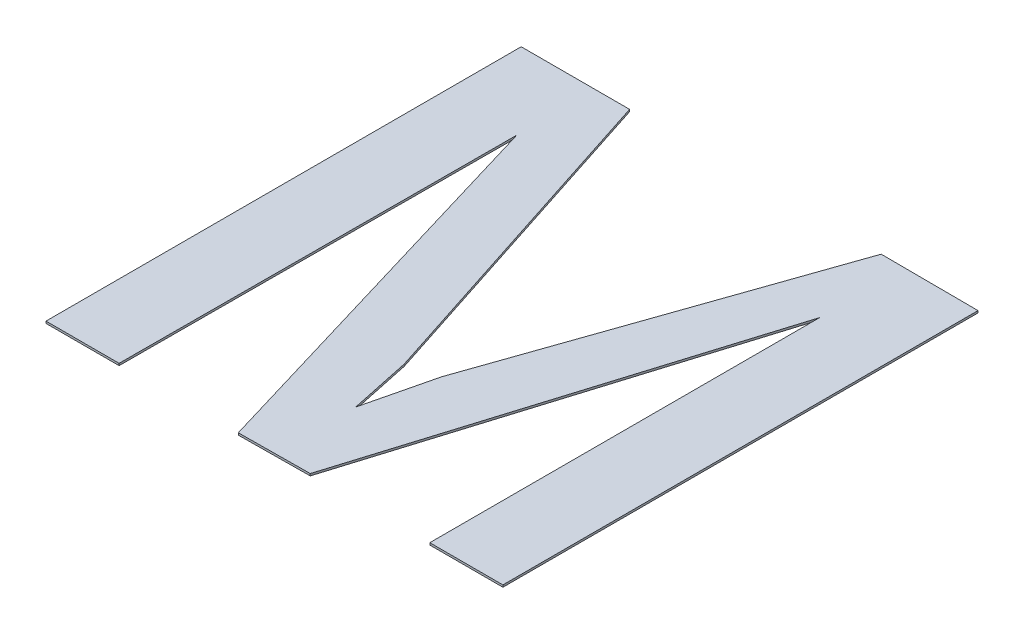
ISO-10303-21;
HEADER;
FILE_DESCRIPTION(('STEP AP214'),'2;1');
FILE_NAME('part.step','',(''),(''),'','','');
FILE_SCHEMA(('AUTOMOTIVE_DESIGN { 1 0 10303 214 1 1 1 1 }'));
ENDSEC;
DATA;
#1=APPLICATION_CONTEXT('core data for automotive mechanical design processes');
#2=APPLICATION_PROTOCOL_DEFINITION('international standard','automotive_design',2000,#1);
#3=PRODUCT_CONTEXT('',#1,'mechanical');
#4=PRODUCT('Part','Part','',(#3));
#5=PRODUCT_RELATED_PRODUCT_CATEGORY('part','',(#4));
#6=PRODUCT_DEFINITION_FORMATION('','',#4);
#7=PRODUCT_DEFINITION_CONTEXT('part definition',#1,'design');
#8=PRODUCT_DEFINITION('design','',#6,#7);
#9=PRODUCT_DEFINITION_SHAPE('','',#8);
#10=(LENGTH_UNIT() NAMED_UNIT(*) SI_UNIT(.MILLI.,.METRE.));
#11=(NAMED_UNIT(*) PLANE_ANGLE_UNIT() SI_UNIT($,.RADIAN.));
#12=(NAMED_UNIT(*) SI_UNIT($,.STERADIAN.) SOLID_ANGLE_UNIT());
#13=UNCERTAINTY_MEASURE_WITH_UNIT(LENGTH_MEASURE(1.E-05),#10,'distance_accuracy_value','');
#14=(GEOMETRIC_REPRESENTATION_CONTEXT(3) GLOBAL_UNCERTAINTY_ASSIGNED_CONTEXT((#13)) GLOBAL_UNIT_ASSIGNED_CONTEXT((#10,
#11,#12)) REPRESENTATION_CONTEXT('',''));
#15=CARTESIAN_POINT('',(0.,0.,0.));
#16=DIRECTION('',(0.,0.,1.));
#17=DIRECTION('',(1.,0.,0.));
#18=AXIS2_PLACEMENT_3D('',#15,#16,#17);
#19=CARTESIAN_POINT('',(-3.699383372726,11.44,-1.804601424767));
#20=DIRECTION('',(0.,-1.,0.));
#21=DIRECTION('',(0.,0.,-1.));
#22=AXIS2_PLACEMENT_3D('',#19,#20,#21);
#23=PLANE('',#22);
#24=DIRECTION('',(0.286019784655095,0.,0.958223712285317));
#25=VECTOR('',#24,1.);
#26=CARTESIAN_POINT('',(-2.76126793001,11.44,-1.80182319542));
#27=LINE('',#26,#25);
#28=CARTESIAN_POINT('',(-2.76126793001,11.44,-1.80182319541998));
#29=VERTEX_POINT('',#28);
#30=CARTESIAN_POINT('',(-3.33775051943821,11.44,-3.73315562956094));
#31=VERTEX_POINT('',#30);
#32=EDGE_CURVE('E127',#29,#31,#27,.F.);
#33=ORIENTED_EDGE('',*,*,#32,.F.);
#34=DIRECTION('',(-0.999956330924237,0.,0.00934538627007759));
#35=VECTOR('',#34,1.);
#36=CARTESIAN_POINT('',(-2.414452299904,11.44,-1.805064462991));
#37=LINE('',#36,#35);
#38=CARTESIAN_POINT('',(-2.41445229990404,11.44,-1.80506446299101));
#39=VERTEX_POINT('',#38);
#40=EDGE_CURVE('E20',#39,#29,#37,.T.);
#41=ORIENTED_EDGE('',*,*,#40,.F.);
#42=DIRECTION('',(0.293446005168945,0.,-0.95597564929782));
#43=VECTOR('',#42,1.);
#44=CARTESIAN_POINT('',(-1.832413251783,11.44,-3.701205992074));
#45=LINE('',#44,#43);
#46=CARTESIAN_POINT('',(-1.832413251783,11.44,-3.701205992074));
#47=VERTEX_POINT('',#46);
#48=EDGE_CURVE('E208',#47,#39,#45,.F.);
#49=ORIENTED_EDGE('',*,*,#48,.F.);
#50=DIRECTION('',(0.,0.,1.));
#51=VECTOR('',#50,1.);
#52=CARTESIAN_POINT('',(-1.832413251783,11.44,-1.804601424767));
#53=LINE('',#52,#51);
#54=CARTESIAN_POINT('',(-1.832413251783,11.44,-1.804601424767));
#55=VERTEX_POINT('',#54);
#56=EDGE_CURVE('E202',#55,#47,#53,.F.);
#57=ORIENTED_EDGE('',*,*,#56,.F.);
#58=DIRECTION('',(1.,0.,0.));
#59=VECTOR('',#58,1.);
#60=CARTESIAN_POINT('',(-1.476799895413,11.44,-1.804601424767));
#61=LINE('',#60,#59);
#62=CARTESIAN_POINT('',(-1.476799895413,11.44,-1.804601424767));
#63=VERTEX_POINT('',#62);
#64=EDGE_CURVE('E196',#63,#55,#61,.F.);
#65=ORIENTED_EDGE('',*,*,#64,.F.);
#66=DIRECTION('',(0.,0.,-1.));
#67=VECTOR('',#66,1.);
#68=CARTESIAN_POINT('',(-1.476799895413,11.44,-4.115625202949));
#69=LINE('',#68,#67);
#70=CARTESIAN_POINT('',(-1.476799895413,11.44,-4.11562520294895));
#71=VERTEX_POINT('',#70);
#72=EDGE_CURVE('E190',#71,#63,#69,.F.);
#73=ORIENTED_EDGE('',*,*,#72,.F.);
#74=DIRECTION('',(-0.999988032582968,0.,-0.00489230935706084));
#75=VECTOR('',#74,1.);
#76=CARTESIAN_POINT('',(-1.950024960791,11.44,-4.117940394071));
#77=LINE('',#76,#75);
#78=CARTESIAN_POINT('',(-1.95002496079098,11.44,-4.11794039407099));
#79=VERTEX_POINT('',#78);
#80=EDGE_CURVE('E184',#79,#71,#77,.F.);
#81=ORIENTED_EDGE('',*,*,#80,.F.);
#82=DIRECTION('',(-0.329023334391957,0.,0.944321791247877));
#83=VECTOR('',#82,1.);
#84=CARTESIAN_POINT('',(-2.502429562548,11.44,-2.532497513587));
#85=LINE('',#84,#83);
#86=CARTESIAN_POINT('',(-2.50242956254789,11.44,-2.53249751358697));
#87=VERTEX_POINT('',#86);
#88=EDGE_CURVE('E178',#87,#79,#85,.F.);
#89=ORIENTED_EDGE('',*,*,#88,.F.);
#90=DIRECTION('',(-0.234988560364918,0.,0.971998136056661));
#91=VECTOR('',#90,1.);
#92=CARTESIAN_POINT('',(-2.583924290049,11.44,-2.195405686194));
#93=LINE('',#92,#91);
#94=CARTESIAN_POINT('',(-2.58392429004913,11.44,-2.19540568619397));
#95=VERTEX_POINT('',#94);
#96=EDGE_CURVE('E172',#95,#87,#93,.F.);
#97=ORIENTED_EDGE('',*,*,#96,.F.);
#98=DIRECTION('',(-0.206847423080903,0.,-0.978373212820542));
#99=VECTOR('',#98,1.);
#100=CARTESIAN_POINT('',(-2.647360526798,11.44,-2.495454455632));
#101=LINE('',#100,#99);
#102=CARTESIAN_POINT('',(-2.64736052679807,11.44,-2.49545445563197));
#103=VERTEX_POINT('',#102);
#104=EDGE_CURVE('E166',#103,#95,#101,.F.);
#105=ORIENTED_EDGE('',*,*,#104,.F.);
#106=DIRECTION('',(-0.307979502931853,0.,-0.951392992287545));
#107=VECTOR('',#106,1.);
#108=CARTESIAN_POINT('',(-3.171982835089,11.44,-4.116088241173));
#109=LINE('',#108,#107);
#110=CARTESIAN_POINT('',(-3.171982835089,11.44,-4.116088241173));
#111=VERTEX_POINT('',#110);
#112=EDGE_CURVE('E160',#111,#103,#109,.F.);
#113=ORIENTED_EDGE('',*,*,#112,.F.);
#114=DIRECTION('',(-1.,0.,0.));
#115=VECTOR('',#114,1.);
#116=CARTESIAN_POINT('',(-3.699383372726,11.44,-4.116088241173));
#117=LINE('',#116,#115);
#118=CARTESIAN_POINT('',(-3.699383372726,11.44,-4.116088241173));
#119=VERTEX_POINT('',#118);
#120=EDGE_CURVE('E154',#119,#111,#117,.F.);
#121=ORIENTED_EDGE('',*,*,#120,.F.);
#122=DIRECTION('',(0.,0.,1.));
#123=VECTOR('',#122,1.);
#124=CARTESIAN_POINT('',(-3.699383372726,11.44,-1.804601424767));
#125=LINE('',#124,#123);
#126=CARTESIAN_POINT('',(-3.699383372726,11.44,-1.804601424767));
#127=VERTEX_POINT('',#126);
#128=EDGE_CURVE('E148',#127,#119,#125,.F.);
#129=ORIENTED_EDGE('',*,*,#128,.F.);
#130=DIRECTION('',(1.,0.,0.));
#131=VECTOR('',#130,1.);
#132=CARTESIAN_POINT('',(-3.343770016356,11.44,-1.804601424767));
#133=LINE('',#132,#131);
#134=CARTESIAN_POINT('',(-3.34377001635593,11.44,-1.804601424767));
#135=VERTEX_POINT('',#134);
#136=EDGE_CURVE('E122',#135,#127,#133,.F.);
#137=ORIENTED_EDGE('',*,*,#136,.F.);
#138=DIRECTION('',(0.00312123329561154,0.,-0.999995128939494));
#139=VECTOR('',#138,1.);
#140=CARTESIAN_POINT('',(-3.337750519438,11.44,-3.733155629561));
#141=LINE('',#140,#139);
#142=EDGE_CURVE('E125',#31,#135,#141,.F.);
#143=ORIENTED_EDGE('',*,*,#142,.F.);
#144=EDGE_LOOP('',(#33,#41,#49,#57,#65,#73,#81,#89,#97,#105,#113,#121,#129,#137,#143));
#145=FACE_BOUND('',#144,.T.);
#146=ADVANCED_FACE('F17',(#145),#23,.F.);
#147=CARTESIAN_POINT('',(-2.76126793001,11.44,-1.80182319542));
#148=DIRECTION('',(-0.958223712285317,0.,0.286019784655095));
#149=DIRECTION('',(0.286019784655095,0.,0.958223712285317));
#150=AXIS2_PLACEMENT_3D('',#147,#148,#149);
#151=PLANE('',#150);
#152=DIRECTION('',(-0.286019784654686,0.,-0.958223712285438));
#153=VECTOR('',#152,1.);
#154=CARTESIAN_POINT('',(-2.76126793001,11.43,-1.80182319542));
#155=LINE('',#154,#153);
#156=CARTESIAN_POINT('',(-2.76126793001,11.43,-1.80182319541998));
#157=VERTEX_POINT('',#156);
#158=CARTESIAN_POINT('',(-3.33775051943841,11.43,-3.73315562956088));
#159=VERTEX_POINT('',#158);
#160=EDGE_CURVE('E215',#157,#159,#155,.T.);
#161=ORIENTED_EDGE('',*,*,#160,.F.);
#162=DIRECTION('',(0.,1.,0.));
#163=VECTOR('',#162,1.);
#164=CARTESIAN_POINT('',(-2.76126793001,11.44,-1.80182319541992));
#165=LINE('',#164,#163);
#166=EDGE_CURVE('E138',#29,#157,#165,.F.);
#167=ORIENTED_EDGE('',*,*,#166,.F.);
#168=ORIENTED_EDGE('',*,*,#32,.T.);
#169=DIRECTION('',(0.,1.,0.));
#170=VECTOR('',#169,1.);
#171=CARTESIAN_POINT('',(-3.337750519438,11.44,-3.733155629561));
#172=LINE('',#171,#170);
#173=EDGE_CURVE('E132',#159,#31,#172,.T.);
#174=ORIENTED_EDGE('',*,*,#173,.F.);
#175=EDGE_LOOP('',(#161,#167,#168,#174));
#176=FACE_BOUND('',#175,.T.);
#177=ADVANCED_FACE('F135',(#176),#151,.T.);
#178=CARTESIAN_POINT('',(-3.337750519438,11.44,-3.733155629561));
#179=DIRECTION('',(0.999995128939494,0.,0.00312123329561154));
#180=DIRECTION('',(0.00312123329561154,0.,-0.999995128939494));
#181=AXIS2_PLACEMENT_3D('',#178,#179,#180);
#182=PLANE('',#181);
#183=DIRECTION('',(-0.00312123329575223,0.,0.999995128939493));
#184=VECTOR('',#183,1.);
#185=CARTESIAN_POINT('',(-3.337750519438,11.43,-3.733155629561));
#186=LINE('',#185,#184);
#187=CARTESIAN_POINT('',(-3.34377001635586,11.43,-1.804601424767));
#188=VERTEX_POINT('',#187);
#189=EDGE_CURVE('E141',#159,#188,#186,.T.);
#190=ORIENTED_EDGE('',*,*,#189,.F.);
#191=ORIENTED_EDGE('',*,*,#173,.T.);
#192=ORIENTED_EDGE('',*,*,#142,.T.);
#193=DIRECTION('',(0.,1.,0.));
#194=VECTOR('',#193,1.);
#195=CARTESIAN_POINT('',(-3.343770016356,11.44,-1.804601424767));
#196=LINE('',#195,#194);
#197=EDGE_CURVE('E144',#188,#135,#196,.T.);
#198=ORIENTED_EDGE('',*,*,#197,.F.);
#199=EDGE_LOOP('',(#190,#191,#192,#198));
#200=FACE_BOUND('',#199,.T.);
#201=ADVANCED_FACE('F139',(#200),#182,.T.);
#202=CARTESIAN_POINT('',(-3.343770016356,11.44,-1.804601424767));
#203=DIRECTION('',(0.,0.,1.));
#204=DIRECTION('',(1.,0.,0.));
#205=AXIS2_PLACEMENT_3D('',#202,#203,#204);
#206=PLANE('',#205);
#207=DIRECTION('',(1.,0.,0.));
#208=VECTOR('',#207,1.);
#209=CARTESIAN_POINT('',(-3.699383372726,11.43,-1.804601424767));
#210=LINE('',#209,#208);
#211=CARTESIAN_POINT('',(-3.699383372726,11.43,-1.804601424767));
#212=VERTEX_POINT('',#211);
#213=EDGE_CURVE('E218',#188,#212,#210,.F.);
#214=ORIENTED_EDGE('',*,*,#213,.F.);
#215=ORIENTED_EDGE('',*,*,#197,.T.);
#216=ORIENTED_EDGE('',*,*,#136,.T.);
#217=DIRECTION('',(0.,1.,0.));
#218=VECTOR('',#217,1.);
#219=CARTESIAN_POINT('',(-3.699383372726,11.44,-1.804601424767));
#220=LINE('',#219,#218);
#221=EDGE_CURVE('E151',#212,#127,#220,.T.);
#222=ORIENTED_EDGE('',*,*,#221,.F.);
#223=EDGE_LOOP('',(#214,#215,#216,#222));
#224=FACE_BOUND('',#223,.T.);
#225=ADVANCED_FACE('F287',(#224),#206,.T.);
#226=CARTESIAN_POINT('',(-3.699383372726,11.44,-1.804601424767));
#227=DIRECTION('',(-1.,0.,0.));
#228=DIRECTION('',(0.,0.,1.));
#229=AXIS2_PLACEMENT_3D('',#226,#227,#228);
#230=PLANE('',#229);
#231=DIRECTION('',(0.,0.,-1.));
#232=VECTOR('',#231,1.);
#233=CARTESIAN_POINT('',(-3.699383372726,11.43,-1.804601424767));
#234=LINE('',#233,#232);
#235=CARTESIAN_POINT('',(-3.699383372726,11.43,-4.116088241173));
#236=VERTEX_POINT('',#235);
#237=EDGE_CURVE('E221',#212,#236,#234,.T.);
#238=ORIENTED_EDGE('',*,*,#237,.F.);
#239=ORIENTED_EDGE('',*,*,#221,.T.);
#240=ORIENTED_EDGE('',*,*,#128,.T.);
#241=DIRECTION('',(0.,1.,0.));
#242=VECTOR('',#241,1.);
#243=CARTESIAN_POINT('',(-3.699383372726,11.44,-4.116088241173));
#244=LINE('',#243,#242);
#245=EDGE_CURVE('E157',#236,#119,#244,.T.);
#246=ORIENTED_EDGE('',*,*,#245,.F.);
#247=EDGE_LOOP('',(#238,#239,#240,#246));
#248=FACE_BOUND('',#247,.T.);
#249=ADVANCED_FACE('F284',(#248),#230,.T.);
#250=CARTESIAN_POINT('',(-3.699383372726,11.44,-4.116088241173));
#251=DIRECTION('',(0.,0.,-1.));
#252=DIRECTION('',(-1.,0.,0.));
#253=AXIS2_PLACEMENT_3D('',#250,#251,#252);
#254=PLANE('',#253);
#255=DIRECTION('',(1.,0.,0.));
#256=VECTOR('',#255,1.);
#257=CARTESIAN_POINT('',(-3.699383372726,11.43,-4.116088241173));
#258=LINE('',#257,#256);
#259=CARTESIAN_POINT('',(-3.171982835089,11.43,-4.116088241173));
#260=VERTEX_POINT('',#259);
#261=EDGE_CURVE('E224',#236,#260,#258,.T.);
#262=ORIENTED_EDGE('',*,*,#261,.F.);
#263=ORIENTED_EDGE('',*,*,#245,.T.);
#264=ORIENTED_EDGE('',*,*,#120,.T.);
#265=DIRECTION('',(0.,1.,0.));
#266=VECTOR('',#265,1.);
#267=CARTESIAN_POINT('',(-3.171982835089,11.44,-4.116088241173));
#268=LINE('',#267,#266);
#269=EDGE_CURVE('E163',#260,#111,#268,.T.);
#270=ORIENTED_EDGE('',*,*,#269,.F.);
#271=EDGE_LOOP('',(#262,#263,#264,#270));
#272=FACE_BOUND('',#271,.T.);
#273=ADVANCED_FACE('F281',(#272),#254,.T.);
#274=CARTESIAN_POINT('',(-3.171982835089,11.44,-4.116088241173));
#275=DIRECTION('',(0.951392992287545,0.,-0.307979502931853));
#276=DIRECTION('',(-0.307979502931853,0.,-0.951392992287545));
#277=AXIS2_PLACEMENT_3D('',#274,#275,#276);
#278=PLANE('',#277);
#279=DIRECTION('',(0.307979502932014,0.,0.951392992287493));
#280=VECTOR('',#279,1.);
#281=CARTESIAN_POINT('',(-3.171982835089,11.43,-4.116088241173));
#282=LINE('',#281,#280);
#283=CARTESIAN_POINT('',(-2.64736052679814,11.43,-2.49545445563195));
#284=VERTEX_POINT('',#283);
#285=EDGE_CURVE('E227',#260,#284,#282,.T.);
#286=ORIENTED_EDGE('',*,*,#285,.F.);
#287=ORIENTED_EDGE('',*,*,#269,.T.);
#288=ORIENTED_EDGE('',*,*,#112,.T.);
#289=DIRECTION('',(0.,1.,0.));
#290=VECTOR('',#289,1.);
#291=CARTESIAN_POINT('',(-2.647360526798,11.44,-2.495454455632));
#292=LINE('',#291,#290);
#293=EDGE_CURVE('E169',#284,#103,#292,.T.);
#294=ORIENTED_EDGE('',*,*,#293,.F.);
#295=EDGE_LOOP('',(#286,#287,#288,#294));
#296=FACE_BOUND('',#295,.T.);
#297=ADVANCED_FACE('F278',(#296),#278,.T.);
#298=CARTESIAN_POINT('',(-2.647360526798,11.44,-2.495454455632));
#299=DIRECTION('',(0.978373212820542,0.,-0.206847423080903));
#300=DIRECTION('',(-0.206847423080903,0.,-0.978373212820542));
#301=AXIS2_PLACEMENT_3D('',#298,#299,#300);
#302=PLANE('',#301);
#303=DIRECTION('',(0.206847423082553,0.,0.978373212820193));
#304=VECTOR('',#303,1.);
#305=CARTESIAN_POINT('',(-2.647360526798,11.43,-2.495454455632));
#306=LINE('',#305,#304);
#307=CARTESIAN_POINT('',(-2.58392429004925,11.43,-2.19540568619395));
#308=VERTEX_POINT('',#307);
#309=EDGE_CURVE('E230',#284,#308,#306,.T.);
#310=ORIENTED_EDGE('',*,*,#309,.F.);
#311=ORIENTED_EDGE('',*,*,#293,.T.);
#312=ORIENTED_EDGE('',*,*,#104,.T.);
#313=DIRECTION('',(0.,1.,0.));
#314=VECTOR('',#313,1.);
#315=CARTESIAN_POINT('',(-2.583924290049,11.44,-2.195405686194));
#316=LINE('',#315,#314);
#317=EDGE_CURVE('E175',#308,#95,#316,.T.);
#318=ORIENTED_EDGE('',*,*,#317,.F.);
#319=EDGE_LOOP('',(#310,#311,#312,#318));
#320=FACE_BOUND('',#319,.T.);
#321=ADVANCED_FACE('F275',(#320),#302,.T.);
#322=CARTESIAN_POINT('',(-2.583924290049,11.44,-2.195405686194));
#323=DIRECTION('',(-0.971998136056661,0.,-0.234988560364918));
#324=DIRECTION('',(-0.234988560364918,0.,0.971998136056661));
#325=AXIS2_PLACEMENT_3D('',#322,#323,#324);
#326=PLANE('',#325);
#327=DIRECTION('',(0.234988560363676,0.,-0.971998136056961));
#328=VECTOR('',#327,1.);
#329=CARTESIAN_POINT('',(-2.583924290049,11.43,-2.195405686194));
#330=LINE('',#329,#328);
#331=CARTESIAN_POINT('',(-2.50242956254779,11.43,-2.53249751358695));
#332=VERTEX_POINT('',#331);
#333=EDGE_CURVE('E233',#308,#332,#330,.T.);
#334=ORIENTED_EDGE('',*,*,#333,.F.);
#335=ORIENTED_EDGE('',*,*,#317,.T.);
#336=ORIENTED_EDGE('',*,*,#96,.T.);
#337=DIRECTION('',(0.,1.,0.));
#338=VECTOR('',#337,1.);
#339=CARTESIAN_POINT('',(-2.502429562548,11.44,-2.532497513587));
#340=LINE('',#339,#338);
#341=EDGE_CURVE('E181',#332,#87,#340,.T.);
#342=ORIENTED_EDGE('',*,*,#341,.F.);
#343=EDGE_LOOP('',(#334,#335,#336,#342));
#344=FACE_BOUND('',#343,.T.);
#345=ADVANCED_FACE('F272',(#344),#326,.T.);
#346=CARTESIAN_POINT('',(-2.502429562548,11.44,-2.532497513587));
#347=DIRECTION('',(-0.944321791247877,0.,-0.329023334391957));
#348=DIRECTION('',(-0.329023334391957,0.,0.944321791247877));
#349=AXIS2_PLACEMENT_3D('',#346,#347,#348);
#350=PLANE('',#349);
#351=DIRECTION('',(0.329023334391904,0.,-0.944321791247895));
#352=VECTOR('',#351,1.);
#353=CARTESIAN_POINT('',(-2.502429562548,11.43,-2.532497513587));
#354=LINE('',#353,#352);
#355=CARTESIAN_POINT('',(-1.95002496079096,11.43,-4.11794039407098));
#356=VERTEX_POINT('',#355);
#357=EDGE_CURVE('E236',#332,#356,#354,.T.);
#358=ORIENTED_EDGE('',*,*,#357,.F.);
#359=ORIENTED_EDGE('',*,*,#341,.T.);
#360=ORIENTED_EDGE('',*,*,#88,.T.);
#361=DIRECTION('',(0.,1.,0.));
#362=VECTOR('',#361,1.);
#363=CARTESIAN_POINT('',(-1.950024960791,11.44,-4.117940394071));
#364=LINE('',#363,#362);
#365=EDGE_CURVE('E187',#356,#79,#364,.T.);
#366=ORIENTED_EDGE('',*,*,#365,.F.);
#367=EDGE_LOOP('',(#358,#359,#360,#366));
#368=FACE_BOUND('',#367,.T.);
#369=ADVANCED_FACE('F269',(#368),#350,.T.);
#370=CARTESIAN_POINT('',(-1.950024960791,11.44,-4.117940394071));
#371=DIRECTION('',(0.00489230935706084,0.,-0.999988032582968));
#372=DIRECTION('',(-0.999988032582968,0.,-0.00489230935706084));
#373=AXIS2_PLACEMENT_3D('',#370,#371,#372);
#374=PLANE('',#373);
#375=DIRECTION('',(0.99998803258297,0.,0.0048923093566324));
#376=VECTOR('',#375,1.);
#377=CARTESIAN_POINT('',(-1.950024960791,11.43,-4.117940394071));
#378=LINE('',#377,#376);
#379=CARTESIAN_POINT('',(-1.476799895413,11.43,-4.1156252029489));
#380=VERTEX_POINT('',#379);
#381=EDGE_CURVE('E239',#356,#380,#378,.T.);
#382=ORIENTED_EDGE('',*,*,#381,.F.);
#383=ORIENTED_EDGE('',*,*,#365,.T.);
#384=ORIENTED_EDGE('',*,*,#80,.T.);
#385=DIRECTION('',(0.,1.,0.));
#386=VECTOR('',#385,1.);
#387=CARTESIAN_POINT('',(-1.476799895413,11.44,-4.115625202949));
#388=LINE('',#387,#386);
#389=EDGE_CURVE('E193',#380,#71,#388,.T.);
#390=ORIENTED_EDGE('',*,*,#389,.F.);
#391=EDGE_LOOP('',(#382,#383,#384,#390));
#392=FACE_BOUND('',#391,.T.);
#393=ADVANCED_FACE('F266',(#392),#374,.T.);
#394=CARTESIAN_POINT('',(-1.476799895413,11.44,-4.115625202949));
#395=DIRECTION('',(1.,0.,0.));
#396=DIRECTION('',(0.,0.,-1.));
#397=AXIS2_PLACEMENT_3D('',#394,#395,#396);
#398=PLANE('',#397);
#399=DIRECTION('',(0.,0.,-1.));
#400=VECTOR('',#399,1.);
#401=CARTESIAN_POINT('',(-1.476799895413,11.43,-1.804601424767));
#402=LINE('',#401,#400);
#403=CARTESIAN_POINT('',(-1.476799895413,11.43,-1.804601424767));
#404=VERTEX_POINT('',#403);
#405=EDGE_CURVE('E242',#380,#404,#402,.F.);
#406=ORIENTED_EDGE('',*,*,#405,.F.);
#407=ORIENTED_EDGE('',*,*,#389,.T.);
#408=ORIENTED_EDGE('',*,*,#72,.T.);
#409=DIRECTION('',(0.,1.,0.));
#410=VECTOR('',#409,1.);
#411=CARTESIAN_POINT('',(-1.476799895413,11.44,-1.804601424767));
#412=LINE('',#411,#410);
#413=EDGE_CURVE('E199',#404,#63,#412,.T.);
#414=ORIENTED_EDGE('',*,*,#413,.F.);
#415=EDGE_LOOP('',(#406,#407,#408,#414));
#416=FACE_BOUND('',#415,.T.);
#417=ADVANCED_FACE('F263',(#416),#398,.T.);
#418=CARTESIAN_POINT('',(-1.476799895413,11.44,-1.804601424767));
#419=DIRECTION('',(0.,0.,1.));
#420=DIRECTION('',(1.,0.,0.));
#421=AXIS2_PLACEMENT_3D('',#418,#419,#420);
#422=PLANE('',#421);
#423=DIRECTION('',(1.,0.,0.));
#424=VECTOR('',#423,1.);
#425=CARTESIAN_POINT('',(-3.699383372726,11.43,-1.804601424767));
#426=LINE('',#425,#424);
#427=CARTESIAN_POINT('',(-1.832413251783,11.43,-1.804601424767));
#428=VERTEX_POINT('',#427);
#429=EDGE_CURVE('E245',#404,#428,#426,.F.);
#430=ORIENTED_EDGE('',*,*,#429,.F.);
#431=ORIENTED_EDGE('',*,*,#413,.T.);
#432=ORIENTED_EDGE('',*,*,#64,.T.);
#433=DIRECTION('',(0.,1.,0.));
#434=VECTOR('',#433,1.);
#435=CARTESIAN_POINT('',(-1.832413251783,11.44,-1.804601424767));
#436=LINE('',#435,#434);
#437=EDGE_CURVE('E205',#428,#55,#436,.T.);
#438=ORIENTED_EDGE('',*,*,#437,.F.);
#439=EDGE_LOOP('',(#430,#431,#432,#438));
#440=FACE_BOUND('',#439,.T.);
#441=ADVANCED_FACE('F260',(#440),#422,.T.);
#442=CARTESIAN_POINT('',(-1.832413251783,11.44,-1.804601424767));
#443=DIRECTION('',(-1.,0.,0.));
#444=DIRECTION('',(0.,0.,1.));
#445=AXIS2_PLACEMENT_3D('',#442,#443,#444);
#446=PLANE('',#445);
#447=DIRECTION('',(0.,0.,-1.));
#448=VECTOR('',#447,1.);
#449=CARTESIAN_POINT('',(-1.832413251783,11.43,-1.804601424767));
#450=LINE('',#449,#448);
#451=CARTESIAN_POINT('',(-1.832413251783,11.43,-3.701205992074));
#452=VERTEX_POINT('',#451);
#453=EDGE_CURVE('E248',#428,#452,#450,.T.);
#454=ORIENTED_EDGE('',*,*,#453,.F.);
#455=ORIENTED_EDGE('',*,*,#437,.T.);
#456=ORIENTED_EDGE('',*,*,#56,.T.);
#457=DIRECTION('',(0.,1.,0.));
#458=VECTOR('',#457,1.);
#459=CARTESIAN_POINT('',(-1.832413251783,11.44,-3.701205992074));
#460=LINE('',#459,#458);
#461=EDGE_CURVE('E210',#452,#47,#460,.T.);
#462=ORIENTED_EDGE('',*,*,#461,.F.);
#463=EDGE_LOOP('',(#454,#455,#456,#462));
#464=FACE_BOUND('',#463,.T.);
#465=ADVANCED_FACE('F257',(#464),#446,.T.);
#466=CARTESIAN_POINT('',(-1.832413251783,11.44,-3.701205992074));
#467=DIRECTION('',(0.95597564929782,0.,0.293446005168945));
#468=DIRECTION('',(0.293446005168945,0.,-0.95597564929782));
#469=AXIS2_PLACEMENT_3D('',#466,#467,#468);
#470=PLANE('',#469);
#471=DIRECTION('',(-0.293446005168857,0.,0.955975649297846));
#472=VECTOR('',#471,1.);
#473=CARTESIAN_POINT('',(-1.832413251783,11.43,-3.701205992074));
#474=LINE('',#473,#472);
#475=CARTESIAN_POINT('',(-2.41445229990409,11.43,-1.80506446299103));
#476=VERTEX_POINT('',#475);
#477=EDGE_CURVE('E26',#452,#476,#474,.T.);
#478=ORIENTED_EDGE('',*,*,#477,.F.);
#479=ORIENTED_EDGE('',*,*,#461,.T.);
#480=ORIENTED_EDGE('',*,*,#48,.T.);
#481=DIRECTION('',(0.,1.,0.));
#482=VECTOR('',#481,1.);
#483=CARTESIAN_POINT('',(-2.414452299904,11.44,-1.805064462991));
#484=LINE('',#483,#482);
#485=EDGE_CURVE('E35',#476,#39,#484,.T.);
#486=ORIENTED_EDGE('',*,*,#485,.F.);
#487=EDGE_LOOP('',(#478,#479,#480,#486));
#488=FACE_BOUND('',#487,.T.);
#489=ADVANCED_FACE('F255',(#488),#470,.T.);
#490=CARTESIAN_POINT('',(-2.414452299904,11.44,-1.805064462991));
#491=DIRECTION('',(0.0093453862703222,0.,0.999956330924235));
#492=DIRECTION('',(0.999956330924235,0.,-0.0093453862703222));
#493=AXIS2_PLACEMENT_3D('',#490,#491,#492);
#494=PLANE('',#493);
#495=DIRECTION('',(-0.999956330924237,0.,0.00934538627007759));
#496=VECTOR('',#495,1.);
#497=CARTESIAN_POINT('',(-2.414452299904,11.43,-1.805064462991));
#498=LINE('',#497,#496);
#499=EDGE_CURVE('E11',#476,#157,#498,.T.);
#500=ORIENTED_EDGE('',*,*,#499,.F.);
#501=ORIENTED_EDGE('',*,*,#485,.T.);
#502=ORIENTED_EDGE('',*,*,#40,.T.);
#503=ORIENTED_EDGE('',*,*,#166,.T.);
#504=EDGE_LOOP('',(#500,#501,#502,#503));
#505=FACE_BOUND('',#504,.T.);
#506=ADVANCED_FACE('F289',(#505),#494,.T.);
#507=CARTESIAN_POINT('',(-3.699383372726,11.43,-1.804601424767));
#508=DIRECTION('',(0.,-1.,0.));
#509=DIRECTION('',(0.,0.,-1.));
#510=AXIS2_PLACEMENT_3D('',#507,#508,#509);
#511=PLANE('',#510);
#512=ORIENTED_EDGE('',*,*,#477,.T.);
#513=ORIENTED_EDGE('',*,*,#499,.T.);
#514=ORIENTED_EDGE('',*,*,#160,.T.);
#515=ORIENTED_EDGE('',*,*,#189,.T.);
#516=ORIENTED_EDGE('',*,*,#213,.T.);
#517=ORIENTED_EDGE('',*,*,#237,.T.);
#518=ORIENTED_EDGE('',*,*,#261,.T.);
#519=ORIENTED_EDGE('',*,*,#285,.T.);
#520=ORIENTED_EDGE('',*,*,#309,.T.);
#521=ORIENTED_EDGE('',*,*,#333,.T.);
#522=ORIENTED_EDGE('',*,*,#357,.T.);
#523=ORIENTED_EDGE('',*,*,#381,.T.);
#524=ORIENTED_EDGE('',*,*,#405,.T.);
#525=ORIENTED_EDGE('',*,*,#429,.T.);
#526=ORIENTED_EDGE('',*,*,#453,.T.);
#527=EDGE_LOOP('',(#512,#513,#514,#515,#516,#517,#518,#519,#520,#521,#522,#523,#524,#525,#526));
#528=FACE_BOUND('',#527,.T.);
#529=ADVANCED_FACE('F253',(#528),#511,.T.);
#530=CLOSED_SHELL('',(#146,#177,#201,#225,#249,#273,#297,#321,#345,#369,#393,#417,#441,#465,
#489,#506,#529));
#531=MANIFOLD_SOLID_BREP('B1',#530);
#532=ADVANCED_BREP_SHAPE_REPRESENTATION('',(#18,#531),#14);
#533=SHAPE_DEFINITION_REPRESENTATION(#9,#532);
ENDSEC;
END-ISO-10303-21;
